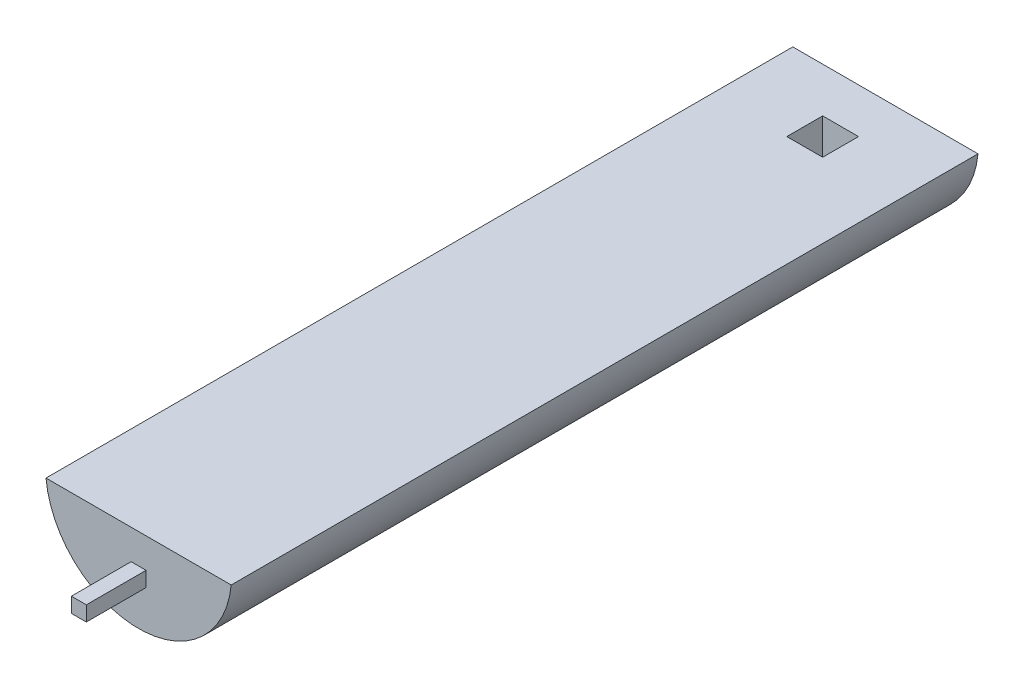
ISO-10303-21;
HEADER;
FILE_DESCRIPTION(('STEP AP214'),'2;1');
FILE_NAME('part.step','',(''),(''),'','','');
FILE_SCHEMA(('AUTOMOTIVE_DESIGN { 1 0 10303 214 1 1 1 1 }'));
ENDSEC;
DATA;
#1=APPLICATION_CONTEXT('core data for automotive mechanical design processes');
#2=APPLICATION_PROTOCOL_DEFINITION('international standard','automotive_design',2000,#1);
#3=PRODUCT_CONTEXT('',#1,'mechanical');
#4=PRODUCT('Part','Part','',(#3));
#5=PRODUCT_RELATED_PRODUCT_CATEGORY('part','',(#4));
#6=PRODUCT_DEFINITION_FORMATION('','',#4);
#7=PRODUCT_DEFINITION_CONTEXT('part definition',#1,'design');
#8=PRODUCT_DEFINITION('design','',#6,#7);
#9=PRODUCT_DEFINITION_SHAPE('','',#8);
#10=(LENGTH_UNIT() NAMED_UNIT(*) SI_UNIT(.MILLI.,.METRE.));
#11=(NAMED_UNIT(*) PLANE_ANGLE_UNIT() SI_UNIT($,.RADIAN.));
#12=(NAMED_UNIT(*) SI_UNIT($,.STERADIAN.) SOLID_ANGLE_UNIT());
#13=UNCERTAINTY_MEASURE_WITH_UNIT(LENGTH_MEASURE(1.E-05),#10,'distance_accuracy_value','');
#14=(GEOMETRIC_REPRESENTATION_CONTEXT(3) GLOBAL_UNCERTAINTY_ASSIGNED_CONTEXT((#13)) GLOBAL_UNIT_ASSIGNED_CONTEXT((#10,
#11,#12)) REPRESENTATION_CONTEXT('',''));
#15=CARTESIAN_POINT('',(0.,0.,0.));
#16=DIRECTION('',(0.,0.,1.));
#17=DIRECTION('',(1.,0.,0.));
#18=AXIS2_PLACEMENT_3D('',#15,#16,#17);
#19=CARTESIAN_POINT('',(0.,0.,200.));
#20=DIRECTION('',(0.,0.,1.));
#21=DIRECTION('',(1.,0.,0.));
#22=AXIS2_PLACEMENT_3D('',#19,#20,#21);
#23=PLANE('',#22);
#24=DIRECTION('',(1.,0.,0.));
#25=VECTOR('',#24,1.);
#26=CARTESIAN_POINT('',(-31.859064644148,-3.,200.));
#27=LINE('',#26,#25);
#28=CARTESIAN_POINT('',(-31.,-3.,200.));
#29=VERTEX_POINT('',#28);
#30=CARTESIAN_POINT('',(31.,-3.,200.));
#31=VERTEX_POINT('',#30);
#32=EDGE_CURVE('E218',#29,#31,#27,.T.);
#33=ORIENTED_EDGE('',*,*,#32,.F.);
#34=CARTESIAN_POINT('',(0.,0.,200.));
#35=DIRECTION('',(0.,0.,1.));
#36=DIRECTION('',(-1.,0.,0.));
#37=AXIS2_PLACEMENT_3D('',#34,#35,#36);
#38=CIRCLE('',#37,31.1448230047949);
#39=EDGE_CURVE('E206',#29,#31,#38,.T.);
#40=ORIENTED_EDGE('',*,*,#39,.T.);
#41=EDGE_LOOP('',(#33,#40));
#42=FACE_BOUND('',#41,.T.);
#43=DIRECTION('',(1.,0.,0.));
#44=VECTOR('',#43,1.);
#45=CARTESIAN_POINT('',(-2.5,-18.,200.));
#46=LINE('',#45,#44);
#47=CARTESIAN_POINT('',(-2.5,-18.,200.));
#48=VERTEX_POINT('',#47);
#49=CARTESIAN_POINT('',(2.5,-18.,200.));
#50=VERTEX_POINT('',#49);
#51=EDGE_CURVE('E184',#48,#50,#46,.T.);
#52=ORIENTED_EDGE('',*,*,#51,.F.);
#53=DIRECTION('',(0.,-1.,0.));
#54=VECTOR('',#53,1.);
#55=CARTESIAN_POINT('',(-2.5,-13.,200.));
#56=LINE('',#55,#54);
#57=CARTESIAN_POINT('',(-2.5,-13.,200.));
#58=VERTEX_POINT('',#57);
#59=EDGE_CURVE('E165',#58,#48,#56,.T.);
#60=ORIENTED_EDGE('',*,*,#59,.F.);
#61=DIRECTION('',(-1.,0.,0.));
#62=VECTOR('',#61,1.);
#63=CARTESIAN_POINT('',(-2.5,-13.,200.));
#64=LINE('',#63,#62);
#65=CARTESIAN_POINT('',(2.5,-13.,200.));
#66=VERTEX_POINT('',#65);
#67=EDGE_CURVE('E171',#66,#58,#64,.T.);
#68=ORIENTED_EDGE('',*,*,#67,.F.);
#69=DIRECTION('',(0.,1.,0.));
#70=VECTOR('',#69,1.);
#71=CARTESIAN_POINT('',(2.5,-13.,200.));
#72=LINE('',#71,#70);
#73=EDGE_CURVE('E187',#50,#66,#72,.T.);
#74=ORIENTED_EDGE('',*,*,#73,.F.);
#75=EDGE_LOOP('',(#52,#60,#68,#74));
#76=FACE_BOUND('',#75,.T.);
#77=ADVANCED_FACE('F45',(#42,#76),#23,.T.);
#78=CARTESIAN_POINT('',(-31.859064644148,-3.,200.));
#79=DIRECTION('',(0.,1.,0.));
#80=DIRECTION('',(0.,0.,1.));
#81=AXIS2_PLACEMENT_3D('',#78,#79,#80);
#82=PLANE('',#81);
#83=DIRECTION('',(0.,0.,1.));
#84=VECTOR('',#83,1.);
#85=CARTESIAN_POINT('',(-6.00000000000001,-3.,-35.));
#86=LINE('',#85,#84);
#87=CARTESIAN_POINT('',(-6.00000000000001,-3.,-35.));
#88=VERTEX_POINT('',#87);
#89=CARTESIAN_POINT('',(-6.00000000000001,-3.,-23.));
#90=VERTEX_POINT('',#89);
#91=EDGE_CURVE('E60',#88,#90,#86,.T.);
#92=ORIENTED_EDGE('',*,*,#91,.F.);
#93=DIRECTION('',(-1.,0.,0.));
#94=VECTOR('',#93,1.);
#95=CARTESIAN_POINT('',(-6.00000000000001,-3.,-35.));
#96=LINE('',#95,#94);
#97=CARTESIAN_POINT('',(6.00000000000001,-3.,-35.));
#98=VERTEX_POINT('',#97);
#99=EDGE_CURVE('E143',#98,#88,#96,.T.);
#100=ORIENTED_EDGE('',*,*,#99,.F.);
#101=DIRECTION('',(0.,0.,-1.));
#102=VECTOR('',#101,1.);
#103=CARTESIAN_POINT('',(6.00000000000001,-3.,-35.));
#104=LINE('',#103,#102);
#105=CARTESIAN_POINT('',(6.00000000000001,-3.,-23.));
#106=VERTEX_POINT('',#105);
#107=EDGE_CURVE('E125',#106,#98,#104,.T.);
#108=ORIENTED_EDGE('',*,*,#107,.F.);
#109=DIRECTION('',(1.,0.,0.));
#110=VECTOR('',#109,1.);
#111=CARTESIAN_POINT('',(-6.00000000000001,-3.,-23.));
#112=LINE('',#111,#110);
#113=EDGE_CURVE('E135',#90,#106,#112,.T.);
#114=ORIENTED_EDGE('',*,*,#113,.F.);
#115=EDGE_LOOP('',(#92,#100,#108,#114));
#116=FACE_BOUND('',#115,.T.);
#117=DIRECTION('',(0.,0.,-1.));
#118=VECTOR('',#117,1.);
#119=CARTESIAN_POINT('',(31.,-3.,200.));
#120=LINE('',#119,#118);
#121=CARTESIAN_POINT('',(31.,-3.,-50.));
#122=VERTEX_POINT('',#121);
#123=EDGE_CURVE('E209',#31,#122,#120,.T.);
#124=ORIENTED_EDGE('',*,*,#123,.T.);
#125=DIRECTION('',(1.,0.,0.));
#126=VECTOR('',#125,1.);
#127=CARTESIAN_POINT('',(-31.,-3.,-50.));
#128=LINE('',#127,#126);
#129=CARTESIAN_POINT('',(-31.,-3.,-50.));
#130=VERTEX_POINT('',#129);
#131=EDGE_CURVE('E161',#130,#122,#128,.T.);
#132=ORIENTED_EDGE('',*,*,#131,.F.);
#133=DIRECTION('',(0.,0.,-1.));
#134=VECTOR('',#133,1.);
#135=CARTESIAN_POINT('',(-31.,-3.,200.));
#136=LINE('',#135,#134);
#137=EDGE_CURVE('E213',#29,#130,#136,.T.);
#138=ORIENTED_EDGE('',*,*,#137,.F.);
#139=ORIENTED_EDGE('',*,*,#32,.T.);
#140=EDGE_LOOP('',(#124,#132,#138,#139));
#141=FACE_BOUND('',#140,.T.);
#142=ADVANCED_FACE('F140',(#116,#141),#82,.T.);
#143=CARTESIAN_POINT('',(0.,0.,200.));
#144=DIRECTION('',(0.,0.,-1.));
#145=DIRECTION('',(-1.,0.,0.));
#146=AXIS2_PLACEMENT_3D('',#143,#144,#145);
#147=CYLINDRICAL_SURFACE('',#146,31.1448230047949);
#148=CARTESIAN_POINT('',(0.,0.,-35.));
#149=DIRECTION('',(0.,0.,-1.));
#150=DIRECTION('',(-1.,0.,0.));
#151=AXIS2_PLACEMENT_3D('',#148,#149,#150);
#152=CIRCLE('',#151,31.1448230047949);
#153=CARTESIAN_POINT('',(6.00000000000001,-30.5614135798723,-35.));
#154=VERTEX_POINT('',#153);
#155=CARTESIAN_POINT('',(-6.00000000000001,-30.5614135798723,-35.));
#156=VERTEX_POINT('',#155);
#157=EDGE_CURVE('E53',#154,#156,#152,.T.);
#158=ORIENTED_EDGE('',*,*,#157,.T.);
#159=DIRECTION('',(0.,0.,-1.));
#160=VECTOR('',#159,1.);
#161=CARTESIAN_POINT('',(-6.00000000000001,-30.5614135798723,200.));
#162=LINE('',#161,#160);
#163=CARTESIAN_POINT('',(-6.00000000000001,-30.5614135798723,-23.));
#164=VERTEX_POINT('',#163);
#165=EDGE_CURVE('E11',#156,#164,#162,.F.);
#166=ORIENTED_EDGE('',*,*,#165,.T.);
#167=CARTESIAN_POINT('',(0.,0.,-23.));
#168=DIRECTION('',(0.,0.,1.));
#169=DIRECTION('',(1.,0.,0.));
#170=AXIS2_PLACEMENT_3D('',#167,#168,#169);
#171=CIRCLE('',#170,31.1448230047949);
#172=CARTESIAN_POINT('',(6.00000000000001,-30.5614135798723,-23.));
#173=VERTEX_POINT('',#172);
#174=EDGE_CURVE('E212',#164,#173,#171,.T.);
#175=ORIENTED_EDGE('',*,*,#174,.T.);
#176=DIRECTION('',(0.,0.,-1.));
#177=VECTOR('',#176,1.);
#178=CARTESIAN_POINT('',(6.00000000000001,-30.5614135798723,200.));
#179=LINE('',#178,#177);
#180=EDGE_CURVE('E128',#173,#154,#179,.T.);
#181=ORIENTED_EDGE('',*,*,#180,.T.);
#182=EDGE_LOOP('',(#158,#166,#175,#181));
#183=FACE_BOUND('',#182,.T.);
#184=ORIENTED_EDGE('',*,*,#137,.T.);
#185=CARTESIAN_POINT('',(0.,0.,-50.));
#186=DIRECTION('',(0.,0.,-1.));
#187=DIRECTION('',(-1.,0.,0.));
#188=AXIS2_PLACEMENT_3D('',#185,#186,#187);
#189=CIRCLE('',#188,31.1448230047949);
#190=EDGE_CURVE('E153',#122,#130,#189,.T.);
#191=ORIENTED_EDGE('',*,*,#190,.F.);
#192=ORIENTED_EDGE('',*,*,#123,.F.);
#193=ORIENTED_EDGE('',*,*,#39,.F.);
#194=EDGE_LOOP('',(#184,#191,#192,#193));
#195=FACE_BOUND('',#194,.T.);
#196=ADVANCED_FACE('F231',(#183,#195),#147,.T.);
#197=CARTESIAN_POINT('',(-2.5,-13.,220.));
#198=DIRECTION('',(1.,0.,0.));
#199=DIRECTION('',(0.,0.,-1.));
#200=AXIS2_PLACEMENT_3D('',#197,#198,#199);
#201=PLANE('',#200);
#202=ORIENTED_EDGE('',*,*,#59,.T.);
#203=DIRECTION('',(0.,0.,-1.));
#204=VECTOR('',#203,1.);
#205=CARTESIAN_POINT('',(-2.5,-18.,220.));
#206=LINE('',#205,#204);
#207=CARTESIAN_POINT('',(-2.5,-18.,220.));
#208=VERTEX_POINT('',#207);
#209=EDGE_CURVE('E203',#208,#48,#206,.T.);
#210=ORIENTED_EDGE('',*,*,#209,.F.);
#211=DIRECTION('',(0.,-1.,0.));
#212=VECTOR('',#211,1.);
#213=CARTESIAN_POINT('',(-2.5,-13.,220.));
#214=LINE('',#213,#212);
#215=CARTESIAN_POINT('',(-2.5,-13.,220.));
#216=VERTEX_POINT('',#215);
#217=EDGE_CURVE('E166',#216,#208,#214,.T.);
#218=ORIENTED_EDGE('',*,*,#217,.F.);
#219=DIRECTION('',(0.,0.,-1.));
#220=VECTOR('',#219,1.);
#221=CARTESIAN_POINT('',(-2.5,-13.,220.));
#222=LINE('',#221,#220);
#223=EDGE_CURVE('E180',#216,#58,#222,.T.);
#224=ORIENTED_EDGE('',*,*,#223,.T.);
#225=EDGE_LOOP('',(#202,#210,#218,#224));
#226=FACE_BOUND('',#225,.T.);
#227=ADVANCED_FACE('F256',(#226),#201,.F.);
#228=CARTESIAN_POINT('',(-2.5,-18.,220.));
#229=DIRECTION('',(0.,1.,0.));
#230=DIRECTION('',(0.,0.,1.));
#231=AXIS2_PLACEMENT_3D('',#228,#229,#230);
#232=PLANE('',#231);
#233=ORIENTED_EDGE('',*,*,#51,.T.);
#234=DIRECTION('',(0.,0.,-1.));
#235=VECTOR('',#234,1.);
#236=CARTESIAN_POINT('',(2.5,-18.,220.));
#237=LINE('',#236,#235);
#238=CARTESIAN_POINT('',(2.5,-18.,220.));
#239=VERTEX_POINT('',#238);
#240=EDGE_CURVE('E199',#239,#50,#237,.T.);
#241=ORIENTED_EDGE('',*,*,#240,.F.);
#242=DIRECTION('',(1.,0.,0.));
#243=VECTOR('',#242,1.);
#244=CARTESIAN_POINT('',(-2.5,-18.,220.));
#245=LINE('',#244,#243);
#246=EDGE_CURVE('E170',#208,#239,#245,.T.);
#247=ORIENTED_EDGE('',*,*,#246,.F.);
#248=ORIENTED_EDGE('',*,*,#209,.T.);
#249=EDGE_LOOP('',(#233,#241,#247,#248));
#250=FACE_BOUND('',#249,.T.);
#251=ADVANCED_FACE('F263',(#250),#232,.F.);
#252=CARTESIAN_POINT('',(2.5,-13.,220.));
#253=DIRECTION('',(-1.,0.,0.));
#254=DIRECTION('',(0.,0.,1.));
#255=AXIS2_PLACEMENT_3D('',#252,#253,#254);
#256=PLANE('',#255);
#257=ORIENTED_EDGE('',*,*,#73,.T.);
#258=DIRECTION('',(0.,0.,-1.));
#259=VECTOR('',#258,1.);
#260=CARTESIAN_POINT('',(2.5,-13.,220.));
#261=LINE('',#260,#259);
#262=CARTESIAN_POINT('',(2.5,-13.,220.));
#263=VERTEX_POINT('',#262);
#264=EDGE_CURVE('E196',#263,#66,#261,.T.);
#265=ORIENTED_EDGE('',*,*,#264,.F.);
#266=DIRECTION('',(0.,1.,0.));
#267=VECTOR('',#266,1.);
#268=CARTESIAN_POINT('',(2.5,-13.,220.));
#269=LINE('',#268,#267);
#270=EDGE_CURVE('E174',#239,#263,#269,.T.);
#271=ORIENTED_EDGE('',*,*,#270,.F.);
#272=ORIENTED_EDGE('',*,*,#240,.T.);
#273=EDGE_LOOP('',(#257,#265,#271,#272));
#274=FACE_BOUND('',#273,.T.);
#275=ADVANCED_FACE('F269',(#274),#256,.F.);
#276=CARTESIAN_POINT('',(-2.5,-13.,220.));
#277=DIRECTION('',(0.,-1.,0.));
#278=DIRECTION('',(0.,0.,-1.));
#279=AXIS2_PLACEMENT_3D('',#276,#277,#278);
#280=PLANE('',#279);
#281=ORIENTED_EDGE('',*,*,#67,.T.);
#282=ORIENTED_EDGE('',*,*,#223,.F.);
#283=DIRECTION('',(-1.,0.,0.));
#284=VECTOR('',#283,1.);
#285=CARTESIAN_POINT('',(-2.5,-13.,220.));
#286=LINE('',#285,#284);
#287=EDGE_CURVE('E177',#263,#216,#286,.T.);
#288=ORIENTED_EDGE('',*,*,#287,.F.);
#289=ORIENTED_EDGE('',*,*,#264,.T.);
#290=EDGE_LOOP('',(#281,#282,#288,#289));
#291=FACE_BOUND('',#290,.T.);
#292=ADVANCED_FACE('F273',(#291),#280,.F.);
#293=CARTESIAN_POINT('',(0.,0.,220.));
#294=DIRECTION('',(0.,0.,1.));
#295=DIRECTION('',(1.,0.,0.));
#296=AXIS2_PLACEMENT_3D('',#293,#294,#295);
#297=PLANE('',#296);
#298=ORIENTED_EDGE('',*,*,#217,.T.);
#299=ORIENTED_EDGE('',*,*,#246,.T.);
#300=ORIENTED_EDGE('',*,*,#270,.T.);
#301=ORIENTED_EDGE('',*,*,#287,.T.);
#302=EDGE_LOOP('',(#298,#299,#300,#301));
#303=FACE_BOUND('',#302,.T.);
#304=ADVANCED_FACE('F245',(#303),#297,.T.);
#305=CARTESIAN_POINT('',(0.,0.,-50.));
#306=DIRECTION('',(0.,0.,-1.));
#307=DIRECTION('',(-1.,0.,0.));
#308=AXIS2_PLACEMENT_3D('',#305,#306,#307);
#309=PLANE('',#308);
#310=ORIENTED_EDGE('',*,*,#190,.T.);
#311=ORIENTED_EDGE('',*,*,#131,.T.);
#312=EDGE_LOOP('',(#310,#311));
#313=FACE_BOUND('',#312,.T.);
#314=ADVANCED_FACE('F238',(#313),#309,.T.);
#315=CARTESIAN_POINT('',(-6.00000000000001,-103.,-35.));
#316=DIRECTION('',(-1.,0.,0.));
#317=DIRECTION('',(0.,0.,1.));
#318=AXIS2_PLACEMENT_3D('',#315,#316,#317);
#319=PLANE('',#318);
#320=DIRECTION('',(0.,1.,0.));
#321=VECTOR('',#320,1.);
#322=CARTESIAN_POINT('',(-6.00000000000001,-103.,-35.));
#323=LINE('',#322,#321);
#324=EDGE_CURVE('E150',#156,#88,#323,.T.);
#325=ORIENTED_EDGE('',*,*,#324,.T.);
#326=ORIENTED_EDGE('',*,*,#91,.T.);
#327=DIRECTION('',(0.,1.,0.));
#328=VECTOR('',#327,1.);
#329=CARTESIAN_POINT('',(-6.00000000000001,-103.,-23.));
#330=LINE('',#329,#328);
#331=EDGE_CURVE('E132',#164,#90,#330,.T.);
#332=ORIENTED_EDGE('',*,*,#331,.F.);
#333=ORIENTED_EDGE('',*,*,#165,.F.);
#334=EDGE_LOOP('',(#325,#326,#332,#333));
#335=FACE_BOUND('',#334,.T.);
#336=ADVANCED_FACE('F236',(#335),#319,.F.);
#337=CARTESIAN_POINT('',(-6.00000000000001,-103.,-35.));
#338=DIRECTION('',(0.,0.,-1.));
#339=DIRECTION('',(-1.,0.,0.));
#340=AXIS2_PLACEMENT_3D('',#337,#338,#339);
#341=PLANE('',#340);
#342=DIRECTION('',(0.,1.,0.));
#343=VECTOR('',#342,1.);
#344=CARTESIAN_POINT('',(6.00000000000001,-103.,-35.));
#345=LINE('',#344,#343);
#346=EDGE_CURVE('E131',#154,#98,#345,.T.);
#347=ORIENTED_EDGE('',*,*,#346,.T.);
#348=ORIENTED_EDGE('',*,*,#99,.T.);
#349=ORIENTED_EDGE('',*,*,#324,.F.);
#350=ORIENTED_EDGE('',*,*,#157,.F.);
#351=EDGE_LOOP('',(#347,#348,#349,#350));
#352=FACE_BOUND('',#351,.T.);
#353=ADVANCED_FACE('F235',(#352),#341,.F.);
#354=CARTESIAN_POINT('',(6.00000000000001,-103.,-35.));
#355=DIRECTION('',(1.,0.,0.));
#356=DIRECTION('',(0.,0.,-1.));
#357=AXIS2_PLACEMENT_3D('',#354,#355,#356);
#358=PLANE('',#357);
#359=DIRECTION('',(0.,1.,0.));
#360=VECTOR('',#359,1.);
#361=CARTESIAN_POINT('',(6.00000000000001,-103.,-23.));
#362=LINE('',#361,#360);
#363=EDGE_CURVE('E68',#173,#106,#362,.T.);
#364=ORIENTED_EDGE('',*,*,#363,.T.);
#365=ORIENTED_EDGE('',*,*,#107,.T.);
#366=ORIENTED_EDGE('',*,*,#346,.F.);
#367=ORIENTED_EDGE('',*,*,#180,.F.);
#368=EDGE_LOOP('',(#364,#365,#366,#367));
#369=FACE_BOUND('',#368,.T.);
#370=ADVANCED_FACE('F122',(#369),#358,.F.);
#371=CARTESIAN_POINT('',(-6.00000000000001,-103.,-23.));
#372=DIRECTION('',(0.,0.,1.));
#373=DIRECTION('',(1.,0.,0.));
#374=AXIS2_PLACEMENT_3D('',#371,#372,#373);
#375=PLANE('',#374);
#376=ORIENTED_EDGE('',*,*,#331,.T.);
#377=ORIENTED_EDGE('',*,*,#113,.T.);
#378=ORIENTED_EDGE('',*,*,#363,.F.);
#379=ORIENTED_EDGE('',*,*,#174,.F.);
#380=EDGE_LOOP('',(#376,#377,#378,#379));
#381=FACE_BOUND('',#380,.T.);
#382=ADVANCED_FACE('F136',(#381),#375,.F.);
#383=CLOSED_SHELL('',(#77,#142,#196,#227,#251,#275,#292,#304,#314,#336,#353,#370,#382));
#384=MANIFOLD_SOLID_BREP('B2',#383);
#385=ADVANCED_BREP_SHAPE_REPRESENTATION('',(#18,#384),#14);
#386=SHAPE_DEFINITION_REPRESENTATION(#9,#385);
ENDSEC;
END-ISO-10303-21;
